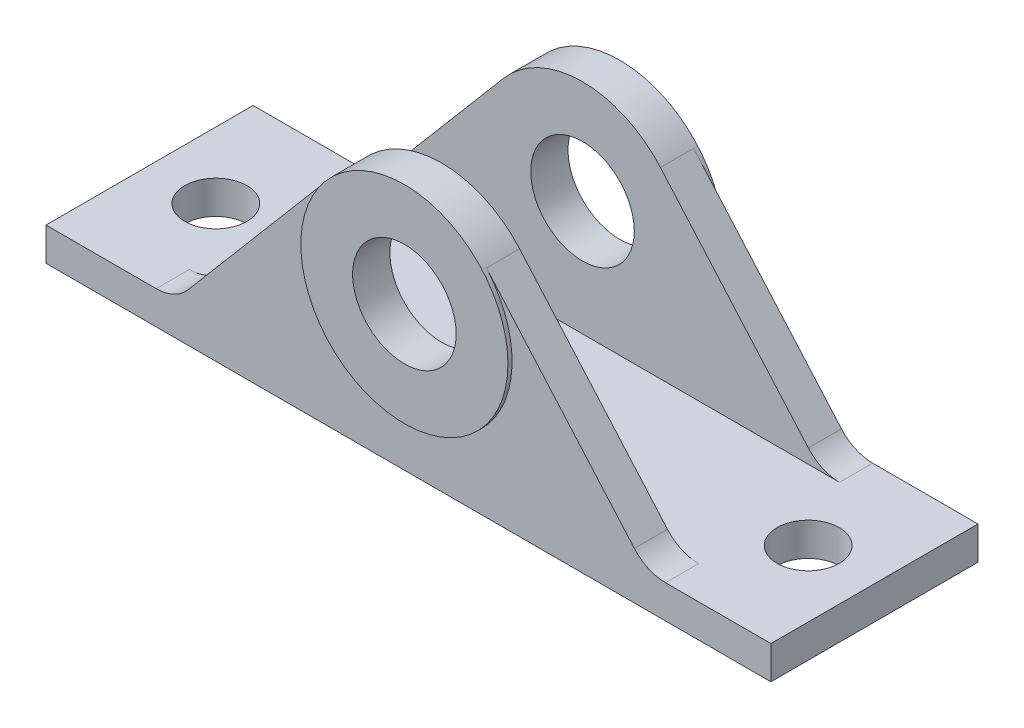
ISO-10303-21;
HEADER;
FILE_DESCRIPTION(('STEP AP214'),'2;1');
FILE_NAME('part.step','',(''),(''),'','','');
FILE_SCHEMA(('AUTOMOTIVE_DESIGN { 1 0 10303 214 1 1 1 1 }'));
ENDSEC;
DATA;
#1=APPLICATION_CONTEXT('core data for automotive mechanical design processes');
#2=APPLICATION_PROTOCOL_DEFINITION('international standard','automotive_design',2000,#1);
#3=PRODUCT_CONTEXT('',#1,'mechanical');
#4=PRODUCT('Part','Part','',(#3));
#5=PRODUCT_RELATED_PRODUCT_CATEGORY('part','',(#4));
#6=PRODUCT_DEFINITION_FORMATION('','',#4);
#7=PRODUCT_DEFINITION_CONTEXT('part definition',#1,'design');
#8=PRODUCT_DEFINITION('design','',#6,#7);
#9=PRODUCT_DEFINITION_SHAPE('','',#8);
#10=(LENGTH_UNIT() NAMED_UNIT(*) SI_UNIT(.MILLI.,.METRE.));
#11=(NAMED_UNIT(*) PLANE_ANGLE_UNIT() SI_UNIT($,.RADIAN.));
#12=(NAMED_UNIT(*) SI_UNIT($,.STERADIAN.) SOLID_ANGLE_UNIT());
#13=UNCERTAINTY_MEASURE_WITH_UNIT(LENGTH_MEASURE(1.E-05),#10,'distance_accuracy_value','');
#14=(GEOMETRIC_REPRESENTATION_CONTEXT(3) GLOBAL_UNCERTAINTY_ASSIGNED_CONTEXT((#13)) GLOBAL_UNIT_ASSIGNED_CONTEXT((#10,
#11,#12)) REPRESENTATION_CONTEXT('',''));
#15=CARTESIAN_POINT('',(0.,0.,0.));
#16=DIRECTION('',(0.,0.,1.));
#17=DIRECTION('',(1.,0.,0.));
#18=AXIS2_PLACEMENT_3D('',#15,#16,#17);
#19=CARTESIAN_POINT('',(0.,8.,50.));
#20=DIRECTION('',(0.,1.,0.));
#21=DIRECTION('',(0.,0.,1.));
#22=AXIS2_PLACEMENT_3D('',#19,#20,#21);
#23=PLANE('',#22);
#24=CARTESIAN_POINT('',(16.,8.,25.));
#25=DIRECTION('',(0.,1.,0.));
#26=DIRECTION('',(0.,0.,1.));
#27=AXIS2_PLACEMENT_3D('',#24,#25,#26);
#28=CIRCLE('',#27,7.5);
#29=CARTESIAN_POINT('',(16.,8.,32.5));
#30=VERTEX_POINT('',#29);
#31=EDGE_CURVE('E399',#30,#30,#28,.T.);
#32=ORIENTED_EDGE('',*,*,#31,.F.);
#33=EDGE_LOOP('',(#32));
#34=FACE_BOUND('',#33,.T.);
#35=CARTESIAN_POINT('',(159.,8.,25.));
#36=DIRECTION('',(0.,1.,0.));
#37=DIRECTION('',(0.,0.,1.));
#38=AXIS2_PLACEMENT_3D('',#35,#36,#37);
#39=CIRCLE('',#38,7.50000000000001);
#40=CARTESIAN_POINT('',(159.,8.,32.5));
#41=VERTEX_POINT('',#40);
#42=EDGE_CURVE('E402',#41,#41,#39,.T.);
#43=ORIENTED_EDGE('',*,*,#42,.F.);
#44=EDGE_LOOP('',(#43));
#45=FACE_BOUND('',#44,.T.);
#46=DIRECTION('',(1.,0.,0.));
#47=VECTOR('',#46,1.);
#48=CARTESIAN_POINT('',(0.,8.,50.));
#49=LINE('',#48,#47);
#50=CARTESIAN_POINT('',(0.,8.,50.));
#51=VERTEX_POINT('',#50);
#52=CARTESIAN_POINT('',(26.5910229898031,8.,50.));
#53=VERTEX_POINT('',#52);
#54=EDGE_CURVE('E247',#51,#53,#49,.T.);
#55=ORIENTED_EDGE('',*,*,#54,.T.);
#56=DIRECTION('',(0.,0.,1.));
#57=VECTOR('',#56,1.);
#58=CARTESIAN_POINT('',(26.5910229898031,8.,42.));
#59=LINE('',#58,#57);
#60=CARTESIAN_POINT('',(26.5910229898031,8.,42.));
#61=VERTEX_POINT('',#60);
#62=EDGE_CURVE('E56',#61,#53,#59,.T.);
#63=ORIENTED_EDGE('',*,*,#62,.F.);
#64=DIRECTION('',(1.,0.,0.));
#65=VECTOR('',#64,1.);
#66=CARTESIAN_POINT('',(0.,8.,42.));
#67=LINE('',#66,#65);
#68=CARTESIAN_POINT('',(149.554580342361,8.,42.));
#69=VERTEX_POINT('',#68);
#70=EDGE_CURVE('E51',#61,#69,#67,.T.);
#71=ORIENTED_EDGE('',*,*,#70,.T.);
#72=DIRECTION('',(0.,0.,1.));
#73=VECTOR('',#72,1.);
#74=CARTESIAN_POINT('',(149.554580342361,8.,42.));
#75=LINE('',#74,#73);
#76=CARTESIAN_POINT('',(149.554580342361,8.,50.));
#77=VERTEX_POINT('',#76);
#78=EDGE_CURVE('E187',#69,#77,#75,.T.);
#79=ORIENTED_EDGE('',*,*,#78,.T.);
#80=CARTESIAN_POINT('',(175.,8.,50.));
#81=VERTEX_POINT('',#80);
#82=EDGE_CURVE('E251',#77,#81,#49,.T.);
#83=ORIENTED_EDGE('',*,*,#82,.T.);
#84=DIRECTION('',(0.,0.,-1.));
#85=VECTOR('',#84,1.);
#86=CARTESIAN_POINT('',(175.,8.,50.));
#87=LINE('',#86,#85);
#88=CARTESIAN_POINT('',(175.,8.,0.));
#89=VERTEX_POINT('',#88);
#90=EDGE_CURVE('E262',#81,#89,#87,.T.);
#91=ORIENTED_EDGE('',*,*,#90,.T.);
#92=DIRECTION('',(1.,0.,0.));
#93=VECTOR('',#92,1.);
#94=CARTESIAN_POINT('',(0.,8.,0.));
#95=LINE('',#94,#93);
#96=CARTESIAN_POINT('',(149.554580342361,8.,0.));
#97=VERTEX_POINT('',#96);
#98=EDGE_CURVE('E246',#97,#89,#95,.T.);
#99=ORIENTED_EDGE('',*,*,#98,.F.);
#100=DIRECTION('',(0.,0.,-1.));
#101=VECTOR('',#100,1.);
#102=CARTESIAN_POINT('',(149.554580342361,8.,8.));
#103=LINE('',#102,#101);
#104=CARTESIAN_POINT('',(149.554580342361,8.,8.));
#105=VERTEX_POINT('',#104);
#106=EDGE_CURVE('E243',#105,#97,#103,.T.);
#107=ORIENTED_EDGE('',*,*,#106,.F.);
#108=DIRECTION('',(1.,0.,0.));
#109=VECTOR('',#108,1.);
#110=CARTESIAN_POINT('',(0.,8.,8.));
#111=LINE('',#110,#109);
#112=CARTESIAN_POINT('',(26.5910229898031,8.,8.));
#113=VERTEX_POINT('',#112);
#114=EDGE_CURVE('E190',#113,#105,#111,.T.);
#115=ORIENTED_EDGE('',*,*,#114,.F.);
#116=DIRECTION('',(0.,0.,-1.));
#117=VECTOR('',#116,1.);
#118=CARTESIAN_POINT('',(26.5910229898031,8.,8.));
#119=LINE('',#118,#117);
#120=CARTESIAN_POINT('',(26.5910229898031,8.,0.));
#121=VERTEX_POINT('',#120);
#122=EDGE_CURVE('E208',#113,#121,#119,.T.);
#123=ORIENTED_EDGE('',*,*,#122,.T.);
#124=CARTESIAN_POINT('',(0.,8.,0.));
#125=VERTEX_POINT('',#124);
#126=EDGE_CURVE('E263',#125,#121,#95,.T.);
#127=ORIENTED_EDGE('',*,*,#126,.F.);
#128=DIRECTION('',(0.,0.,-1.));
#129=VECTOR('',#128,1.);
#130=CARTESIAN_POINT('',(0.,8.,50.));
#131=LINE('',#130,#129);
#132=EDGE_CURVE('E11',#51,#125,#131,.T.);
#133=ORIENTED_EDGE('',*,*,#132,.F.);
#134=EDGE_LOOP('',(#55,#63,#71,#79,#83,#91,#99,#107,#115,#123,#127,#133));
#135=FACE_BOUND('',#134,.T.);
#136=ADVANCED_FACE('F36',(#34,#45,#135),#23,.T.);
#137=CARTESIAN_POINT('',(0.,0.,50.));
#138=DIRECTION('',(-1.,0.,0.));
#139=DIRECTION('',(0.,0.,1.));
#140=AXIS2_PLACEMENT_3D('',#137,#138,#139);
#141=PLANE('',#140);
#142=DIRECTION('',(0.,1.,0.));
#143=VECTOR('',#142,1.);
#144=CARTESIAN_POINT('',(0.,0.,0.));
#145=LINE('',#144,#143);
#146=CARTESIAN_POINT('',(0.,0.,0.));
#147=VERTEX_POINT('',#146);
#148=EDGE_CURVE('E267',#147,#125,#145,.T.);
#149=ORIENTED_EDGE('',*,*,#148,.F.);
#150=DIRECTION('',(0.,0.,-1.));
#151=VECTOR('',#150,1.);
#152=CARTESIAN_POINT('',(0.,0.,50.));
#153=LINE('',#152,#151);
#154=CARTESIAN_POINT('',(0.,0.,50.));
#155=VERTEX_POINT('',#154);
#156=EDGE_CURVE('E44',#155,#147,#153,.T.);
#157=ORIENTED_EDGE('',*,*,#156,.F.);
#158=DIRECTION('',(0.,1.,0.));
#159=VECTOR('',#158,1.);
#160=CARTESIAN_POINT('',(0.,0.,50.));
#161=LINE('',#160,#159);
#162=EDGE_CURVE('E250',#155,#51,#161,.T.);
#163=ORIENTED_EDGE('',*,*,#162,.T.);
#164=ORIENTED_EDGE('',*,*,#132,.T.);
#165=EDGE_LOOP('',(#149,#157,#163,#164));
#166=FACE_BOUND('',#165,.T.);
#167=ADVANCED_FACE('F297',(#166),#141,.T.);
#168=CARTESIAN_POINT('',(0.,0.,50.));
#169=DIRECTION('',(0.,1.,0.));
#170=DIRECTION('',(0.,0.,1.));
#171=AXIS2_PLACEMENT_3D('',#168,#169,#170);
#172=PLANE('',#171);
#173=CARTESIAN_POINT('',(16.,0.,25.));
#174=DIRECTION('',(0.,1.,0.));
#175=DIRECTION('',(0.,0.,1.));
#176=AXIS2_PLACEMENT_3D('',#173,#174,#175);
#177=CIRCLE('',#176,7.5);
#178=CARTESIAN_POINT('',(16.,0.,32.5));
#179=VERTEX_POINT('',#178);
#180=EDGE_CURVE('E405',#179,#179,#177,.T.);
#181=ORIENTED_EDGE('',*,*,#180,.T.);
#182=EDGE_LOOP('',(#181));
#183=FACE_BOUND('',#182,.T.);
#184=CARTESIAN_POINT('',(159.,0.,25.));
#185=DIRECTION('',(0.,1.,0.));
#186=DIRECTION('',(0.,0.,1.));
#187=AXIS2_PLACEMENT_3D('',#184,#185,#186);
#188=CIRCLE('',#187,7.50000000000001);
#189=CARTESIAN_POINT('',(159.,0.,32.5));
#190=VERTEX_POINT('',#189);
#191=EDGE_CURVE('E413',#190,#190,#188,.T.);
#192=ORIENTED_EDGE('',*,*,#191,.T.);
#193=EDGE_LOOP('',(#192));
#194=FACE_BOUND('',#193,.T.);
#195=DIRECTION('',(1.,0.,0.));
#196=VECTOR('',#195,1.);
#197=CARTESIAN_POINT('',(0.,0.,0.));
#198=LINE('',#197,#196);
#199=CARTESIAN_POINT('',(175.,0.,0.));
#200=VERTEX_POINT('',#199);
#201=EDGE_CURVE('E271',#147,#200,#198,.T.);
#202=ORIENTED_EDGE('',*,*,#201,.T.);
#203=DIRECTION('',(0.,0.,-1.));
#204=VECTOR('',#203,1.);
#205=CARTESIAN_POINT('',(175.,0.,50.));
#206=LINE('',#205,#204);
#207=CARTESIAN_POINT('',(175.,0.,50.));
#208=VERTEX_POINT('',#207);
#209=EDGE_CURVE('E281',#208,#200,#206,.T.);
#210=ORIENTED_EDGE('',*,*,#209,.F.);
#211=DIRECTION('',(1.,0.,0.));
#212=VECTOR('',#211,1.);
#213=CARTESIAN_POINT('',(0.,0.,50.));
#214=LINE('',#213,#212);
#215=EDGE_CURVE('E255',#155,#208,#214,.T.);
#216=ORIENTED_EDGE('',*,*,#215,.F.);
#217=ORIENTED_EDGE('',*,*,#156,.T.);
#218=EDGE_LOOP('',(#202,#210,#216,#217));
#219=FACE_BOUND('',#218,.T.);
#220=ADVANCED_FACE('F289',(#183,#194,#219),#172,.F.);
#221=CARTESIAN_POINT('',(175.,0.,50.));
#222=DIRECTION('',(-1.,0.,0.));
#223=DIRECTION('',(0.,0.,1.));
#224=AXIS2_PLACEMENT_3D('',#221,#222,#223);
#225=PLANE('',#224);
#226=DIRECTION('',(0.,1.,0.));
#227=VECTOR('',#226,1.);
#228=CARTESIAN_POINT('',(175.,0.,0.));
#229=LINE('',#228,#227);
#230=EDGE_CURVE('E274',#200,#89,#229,.T.);
#231=ORIENTED_EDGE('',*,*,#230,.T.);
#232=ORIENTED_EDGE('',*,*,#90,.F.);
#233=DIRECTION('',(0.,1.,0.));
#234=VECTOR('',#233,1.);
#235=CARTESIAN_POINT('',(175.,0.,50.));
#236=LINE('',#235,#234);
#237=EDGE_CURVE('E258',#208,#81,#236,.T.);
#238=ORIENTED_EDGE('',*,*,#237,.F.);
#239=ORIENTED_EDGE('',*,*,#209,.T.);
#240=EDGE_LOOP('',(#231,#232,#238,#239));
#241=FACE_BOUND('',#240,.T.);
#242=ADVANCED_FACE('F380',(#241),#225,.F.);
#243=CARTESIAN_POINT('',(0.,0.,50.));
#244=DIRECTION('',(0.,0.,1.));
#245=DIRECTION('',(1.,0.,0.));
#246=AXIS2_PLACEMENT_3D('',#243,#244,#245);
#247=PLANE('',#246);
#248=ORIENTED_EDGE('',*,*,#54,.F.);
#249=ORIENTED_EDGE('',*,*,#162,.F.);
#250=ORIENTED_EDGE('',*,*,#215,.T.);
#251=ORIENTED_EDGE('',*,*,#237,.T.);
#252=ORIENTED_EDGE('',*,*,#82,.F.);
#253=CARTESIAN_POINT('',(149.554580342361,18.,50.));
#254=DIRECTION('',(0.,0.,1.));
#255=DIRECTION('',(1.,0.,0.));
#256=AXIS2_PLACEMENT_3D('',#253,#254,#255);
#257=CIRCLE('',#256,10.);
#258=CARTESIAN_POINT('',(142.0295661025,11.4140937837007,50.));
#259=VERTEX_POINT('',#258);
#260=EDGE_CURVE('E345',#77,#259,#257,.F.);
#261=ORIENTED_EDGE('',*,*,#260,.T.);
#262=DIRECTION('',(0.658590621629925,-0.752501423986101,0.));
#263=VECTOR('',#262,1.);
#264=CARTESIAN_POINT('',(86.0821489565223,75.3392541002859,50.));
#265=LINE('',#264,#263);
#266=CARTESIAN_POINT('',(106.332559554624,52.2012647167426,50.));
#267=VERTEX_POINT('',#266);
#268=EDGE_CURVE('E349',#267,#259,#265,.T.);
#269=ORIENTED_EDGE('',*,*,#268,.F.);
#270=CARTESIAN_POINT('',(87.5200239549711,35.7364991759944,50.));
#271=DIRECTION('',(0.,0.,1.));
#272=DIRECTION('',(1.,0.,0.));
#273=AXIS2_PLACEMENT_3D('',#270,#271,#272);
#274=CIRCLE('',#273,25.);
#275=CARTESIAN_POINT('',(68.452348329964,51.9051028961525,50.));
#276=VERTEX_POINT('',#275);
#277=EDGE_CURVE('E353',#276,#267,#274,.T.);
#278=ORIENTED_EDGE('',*,*,#277,.F.);
#279=DIRECTION('',(0.646744148806324,0.762707025000283,0.));
#280=VECTOR('',#279,1.);
#281=CARTESIAN_POINT('',(14.2166799827152,-12.0551591802496,50.));
#282=LINE('',#281,#280);
#283=CARTESIAN_POINT('',(34.218093239806,11.5325585119368,50.));
#284=VERTEX_POINT('',#283);
#285=EDGE_CURVE('E172',#284,#276,#282,.T.);
#286=ORIENTED_EDGE('',*,*,#285,.F.);
#287=CARTESIAN_POINT('',(26.5910229898031,18.,50.));
#288=DIRECTION('',(0.,0.,1.));
#289=DIRECTION('',(1.,0.,0.));
#290=AXIS2_PLACEMENT_3D('',#287,#288,#289);
#291=CIRCLE('',#290,10.);
#292=EDGE_CURVE('E337',#284,#53,#291,.F.);
#293=ORIENTED_EDGE('',*,*,#292,.T.);
#294=EDGE_LOOP('',(#248,#249,#250,#251,#252,#261,#269,#278,#286,#293));
#295=FACE_BOUND('',#294,.T.);
#296=ADVANCED_FACE('F366',(#295),#247,.T.);
#297=CARTESIAN_POINT('',(0.,0.,0.));
#298=DIRECTION('',(0.,0.,1.));
#299=DIRECTION('',(1.,0.,0.));
#300=AXIS2_PLACEMENT_3D('',#297,#298,#299);
#301=PLANE('',#300);
#302=ORIENTED_EDGE('',*,*,#126,.T.);
#303=CARTESIAN_POINT('',(26.5910229898031,18.,0.));
#304=DIRECTION('',(0.,0.,1.));
#305=DIRECTION('',(1.,0.,0.));
#306=AXIS2_PLACEMENT_3D('',#303,#304,#305);
#307=CIRCLE('',#306,10.);
#308=CARTESIAN_POINT('',(34.218093239806,11.5325585119368,0.));
#309=VERTEX_POINT('',#308);
#310=EDGE_CURVE('E195',#309,#121,#307,.F.);
#311=ORIENTED_EDGE('',*,*,#310,.F.);
#312=DIRECTION('',(0.646744148806324,0.762707025000283,0.));
#313=VECTOR('',#312,1.);
#314=CARTESIAN_POINT('',(14.2166799827152,-12.0551591802496,0.));
#315=LINE('',#314,#313);
#316=CARTESIAN_POINT('',(68.452348329964,51.9051028961525,0.));
#317=VERTEX_POINT('',#316);
#318=EDGE_CURVE('E221',#309,#317,#315,.T.);
#319=ORIENTED_EDGE('',*,*,#318,.T.);
#320=CARTESIAN_POINT('',(87.5200239549711,35.7364991759944,0.));
#321=DIRECTION('',(0.,0.,1.));
#322=DIRECTION('',(1.,0.,0.));
#323=AXIS2_PLACEMENT_3D('',#320,#321,#322);
#324=CIRCLE('',#323,25.);
#325=CARTESIAN_POINT('',(106.332559554624,52.2012647167426,0.));
#326=VERTEX_POINT('',#325);
#327=EDGE_CURVE('E217',#317,#326,#324,.T.);
#328=ORIENTED_EDGE('',*,*,#327,.T.);
#329=DIRECTION('',(0.658590621629925,-0.752501423986101,0.));
#330=VECTOR('',#329,1.);
#331=CARTESIAN_POINT('',(86.0821489565223,75.3392541002859,0.));
#332=LINE('',#331,#330);
#333=CARTESIAN_POINT('',(142.0295661025,11.4140937837007,0.));
#334=VERTEX_POINT('',#333);
#335=EDGE_CURVE('E213',#326,#334,#332,.T.);
#336=ORIENTED_EDGE('',*,*,#335,.T.);
#337=CARTESIAN_POINT('',(149.554580342361,18.,0.));
#338=DIRECTION('',(0.,0.,1.));
#339=DIRECTION('',(1.,0.,0.));
#340=AXIS2_PLACEMENT_3D('',#337,#338,#339);
#341=CIRCLE('',#340,10.);
#342=EDGE_CURVE('E209',#97,#334,#341,.F.);
#343=ORIENTED_EDGE('',*,*,#342,.F.);
#344=ORIENTED_EDGE('',*,*,#98,.T.);
#345=ORIENTED_EDGE('',*,*,#230,.F.);
#346=ORIENTED_EDGE('',*,*,#201,.F.);
#347=ORIENTED_EDGE('',*,*,#148,.T.);
#348=EDGE_LOOP('',(#302,#311,#319,#328,#336,#343,#344,#345,#346,#347));
#349=FACE_BOUND('',#348,.T.);
#350=ADVANCED_FACE('F296',(#349),#301,.F.);
#351=CARTESIAN_POINT('',(149.554580342361,18.,8.));
#352=DIRECTION('',(0.,0.,-1.));
#353=DIRECTION('',(-1.,0.,0.));
#354=AXIS2_PLACEMENT_3D('',#351,#352,#353);
#355=CYLINDRICAL_SURFACE('',#354,10.);
#356=ORIENTED_EDGE('',*,*,#342,.T.);
#357=DIRECTION('',(0.,0.,-1.));
#358=VECTOR('',#357,1.);
#359=CARTESIAN_POINT('',(142.0295661025,11.4140937837007,8.));
#360=LINE('',#359,#358);
#361=CARTESIAN_POINT('',(142.0295661025,11.4140937837007,8.));
#362=VERTEX_POINT('',#361);
#363=EDGE_CURVE('E240',#362,#334,#360,.T.);
#364=ORIENTED_EDGE('',*,*,#363,.F.);
#365=CARTESIAN_POINT('',(149.554580342361,18.,8.));
#366=DIRECTION('',(0.,0.,1.));
#367=DIRECTION('',(1.,0.,0.));
#368=AXIS2_PLACEMENT_3D('',#365,#366,#367);
#369=CIRCLE('',#368,10.);
#370=EDGE_CURVE('E194',#105,#362,#369,.F.);
#371=ORIENTED_EDGE('',*,*,#370,.F.);
#372=ORIENTED_EDGE('',*,*,#106,.T.);
#373=EDGE_LOOP('',(#356,#364,#371,#372));
#374=FACE_BOUND('',#373,.T.);
#375=ADVANCED_FACE('F470',(#374),#355,.F.);
#376=CARTESIAN_POINT('',(86.0821489565223,75.3392541002859,8.));
#377=DIRECTION('',(0.752501423986101,0.658590621629925,0.));
#378=DIRECTION('',(-0.658590621629925,0.752501423986101,0.));
#379=AXIS2_PLACEMENT_3D('',#376,#377,#378);
#380=PLANE('',#379);
#381=ORIENTED_EDGE('',*,*,#335,.F.);
#382=DIRECTION('',(0.,0.,-1.));
#383=VECTOR('',#382,1.);
#384=CARTESIAN_POINT('',(106.332559554624,52.2012647167426,8.));
#385=LINE('',#384,#383);
#386=CARTESIAN_POINT('',(106.332559554624,52.2012647167425,8.));
#387=VERTEX_POINT('',#386);
#388=EDGE_CURVE('E236',#387,#326,#385,.T.);
#389=ORIENTED_EDGE('',*,*,#388,.F.);
#390=DIRECTION('',(0.658590621629925,-0.752501423986101,0.));
#391=VECTOR('',#390,1.);
#392=CARTESIAN_POINT('',(86.0821489565223,75.3392541002859,8.));
#393=LINE('',#392,#391);
#394=EDGE_CURVE('E198',#387,#362,#393,.T.);
#395=ORIENTED_EDGE('',*,*,#394,.T.);
#396=ORIENTED_EDGE('',*,*,#363,.T.);
#397=EDGE_LOOP('',(#381,#389,#395,#396));
#398=FACE_BOUND('',#397,.T.);
#399=ADVANCED_FACE('F467',(#398),#380,.T.);
#400=CARTESIAN_POINT('',(14.2166799827152,-12.0551591802496,8.));
#401=DIRECTION('',(-0.762707025000283,0.646744148806324,0.));
#402=DIRECTION('',(-0.646744148806324,-0.762707025000283,0.));
#403=AXIS2_PLACEMENT_3D('',#400,#401,#402);
#404=PLANE('',#403);
#405=ORIENTED_EDGE('',*,*,#318,.F.);
#406=DIRECTION('',(0.,0.,-1.));
#407=VECTOR('',#406,1.);
#408=CARTESIAN_POINT('',(34.218093239806,11.5325585119368,8.));
#409=LINE('',#408,#407);
#410=CARTESIAN_POINT('',(34.218093239806,11.5325585119368,8.));
#411=VERTEX_POINT('',#410);
#412=EDGE_CURVE('E230',#411,#309,#409,.T.);
#413=ORIENTED_EDGE('',*,*,#412,.F.);
#414=DIRECTION('',(0.646744148806324,0.762707025000283,0.));
#415=VECTOR('',#414,1.);
#416=CARTESIAN_POINT('',(14.2166799827152,-12.0551591802496,8.));
#417=LINE('',#416,#415);
#418=CARTESIAN_POINT('',(68.452348329964,51.9051028961525,8.));
#419=VERTEX_POINT('',#418);
#420=EDGE_CURVE('E202',#411,#419,#417,.T.);
#421=ORIENTED_EDGE('',*,*,#420,.T.);
#422=DIRECTION('',(0.,0.,-1.));
#423=VECTOR('',#422,1.);
#424=CARTESIAN_POINT('',(68.452348329964,51.9051028961525,8.));
#425=LINE('',#424,#423);
#426=EDGE_CURVE('E233',#419,#317,#425,.T.);
#427=ORIENTED_EDGE('',*,*,#426,.T.);
#428=EDGE_LOOP('',(#405,#413,#421,#427));
#429=FACE_BOUND('',#428,.T.);
#430=ADVANCED_FACE('F307',(#429),#404,.T.);
#431=CARTESIAN_POINT('',(26.5910229898031,18.,8.));
#432=DIRECTION('',(0.,0.,-1.));
#433=DIRECTION('',(-1.,0.,0.));
#434=AXIS2_PLACEMENT_3D('',#431,#432,#433);
#435=CYLINDRICAL_SURFACE('',#434,10.);
#436=ORIENTED_EDGE('',*,*,#310,.T.);
#437=ORIENTED_EDGE('',*,*,#122,.F.);
#438=CARTESIAN_POINT('',(26.5910229898031,18.,8.));
#439=DIRECTION('',(0.,0.,1.));
#440=DIRECTION('',(1.,0.,0.));
#441=AXIS2_PLACEMENT_3D('',#438,#439,#440);
#442=CIRCLE('',#441,10.);
#443=EDGE_CURVE('E205',#411,#113,#442,.F.);
#444=ORIENTED_EDGE('',*,*,#443,.F.);
#445=ORIENTED_EDGE('',*,*,#412,.T.);
#446=EDGE_LOOP('',(#436,#437,#444,#445));
#447=FACE_BOUND('',#446,.T.);
#448=ADVANCED_FACE('F462',(#447),#435,.F.);
#449=CARTESIAN_POINT('',(0.,0.,8.));
#450=DIRECTION('',(0.,0.,1.));
#451=DIRECTION('',(1.,0.,0.));
#452=AXIS2_PLACEMENT_3D('',#449,#450,#451);
#453=PLANE('',#452);
#454=ORIENTED_EDGE('',*,*,#114,.T.);
#455=ORIENTED_EDGE('',*,*,#370,.T.);
#456=ORIENTED_EDGE('',*,*,#394,.F.);
#457=CARTESIAN_POINT('',(87.5200239549711,35.7364991759944,8.));
#458=DIRECTION('',(0.,0.,1.));
#459=DIRECTION('',(1.,0.,0.));
#460=AXIS2_PLACEMENT_3D('',#457,#458,#459);
#461=CIRCLE('',#460,25.);
#462=EDGE_CURVE('E315',#387,#419,#461,.T.);
#463=ORIENTED_EDGE('',*,*,#462,.T.);
#464=ORIENTED_EDGE('',*,*,#420,.F.);
#465=ORIENTED_EDGE('',*,*,#443,.T.);
#466=EDGE_LOOP('',(#454,#455,#456,#463,#464,#465));
#467=FACE_BOUND('',#466,.T.);
#468=CARTESIAN_POINT('',(87.5200239549711,35.7364991759944,8.));
#469=DIRECTION('',(0.,0.,1.));
#470=DIRECTION('',(1.,0.,0.));
#471=AXIS2_PLACEMENT_3D('',#468,#469,#470);
#472=CIRCLE('',#471,12.5);
#473=CARTESIAN_POINT('',(100.020023954971,35.7364991759944,8.));
#474=VERTEX_POINT('',#473);
#475=EDGE_CURVE('E322',#474,#474,#472,.T.);
#476=ORIENTED_EDGE('',*,*,#475,.F.);
#477=EDGE_LOOP('',(#476));
#478=FACE_BOUND('',#477,.T.);
#479=ADVANCED_FACE('F317',(#467,#478),#453,.T.);
#480=CARTESIAN_POINT('',(26.5910229898031,18.,42.));
#481=DIRECTION('',(0.,0.,1.));
#482=DIRECTION('',(1.,0.,0.));
#483=AXIS2_PLACEMENT_3D('',#480,#481,#482);
#484=CYLINDRICAL_SURFACE('',#483,10.);
#485=ORIENTED_EDGE('',*,*,#292,.F.);
#486=DIRECTION('',(0.,0.,1.));
#487=VECTOR('',#486,1.);
#488=CARTESIAN_POINT('',(34.218093239806,11.5325585119368,42.));
#489=LINE('',#488,#487);
#490=CARTESIAN_POINT('',(34.218093239806,11.5325585119368,42.));
#491=VERTEX_POINT('',#490);
#492=EDGE_CURVE('E175',#491,#284,#489,.T.);
#493=ORIENTED_EDGE('',*,*,#492,.F.);
#494=CARTESIAN_POINT('',(26.5910229898031,18.,42.));
#495=DIRECTION('',(0.,0.,1.));
#496=DIRECTION('',(1.,0.,0.));
#497=AXIS2_PLACEMENT_3D('',#494,#495,#496);
#498=CIRCLE('',#497,10.);
#499=EDGE_CURVE('E165',#491,#61,#498,.F.);
#500=ORIENTED_EDGE('',*,*,#499,.T.);
#501=ORIENTED_EDGE('',*,*,#62,.T.);
#502=EDGE_LOOP('',(#485,#493,#500,#501));
#503=FACE_BOUND('',#502,.T.);
#504=ADVANCED_FACE('F364',(#503),#484,.F.);
#505=CARTESIAN_POINT('',(14.2166799827152,-12.0551591802496,42.));
#506=DIRECTION('',(0.762707025000283,-0.646744148806324,0.));
#507=DIRECTION('',(0.646744148806324,0.762707025000283,0.));
#508=AXIS2_PLACEMENT_3D('',#505,#506,#507);
#509=PLANE('',#508);
#510=ORIENTED_EDGE('',*,*,#285,.T.);
#511=DIRECTION('',(0.,0.,1.));
#512=VECTOR('',#511,1.);
#513=CARTESIAN_POINT('',(68.452348329964,51.9051028961525,42.));
#514=LINE('',#513,#512);
#515=CARTESIAN_POINT('',(68.452348329964,51.9051028961525,42.));
#516=VERTEX_POINT('',#515);
#517=EDGE_CURVE('E150',#516,#276,#514,.T.);
#518=ORIENTED_EDGE('',*,*,#517,.F.);
#519=DIRECTION('',(0.646744148806324,0.762707025000283,0.));
#520=VECTOR('',#519,1.);
#521=CARTESIAN_POINT('',(14.2166799827152,-12.0551591802496,42.));
#522=LINE('',#521,#520);
#523=EDGE_CURVE('E162',#491,#516,#522,.T.);
#524=ORIENTED_EDGE('',*,*,#523,.F.);
#525=ORIENTED_EDGE('',*,*,#492,.T.);
#526=EDGE_LOOP('',(#510,#518,#524,#525));
#527=FACE_BOUND('',#526,.T.);
#528=ADVANCED_FACE('F170',(#527),#509,.F.);
#529=CARTESIAN_POINT('',(86.0821489565223,75.3392541002859,42.));
#530=DIRECTION('',(-0.752501423986101,-0.658590621629925,0.));
#531=DIRECTION('',(0.658590621629925,-0.752501423986101,0.));
#532=AXIS2_PLACEMENT_3D('',#529,#530,#531);
#533=PLANE('',#532);
#534=ORIENTED_EDGE('',*,*,#268,.T.);
#535=DIRECTION('',(0.,0.,1.));
#536=VECTOR('',#535,1.);
#537=CARTESIAN_POINT('',(142.0295661025,11.4140937837007,42.));
#538=LINE('',#537,#536);
#539=CARTESIAN_POINT('',(142.0295661025,11.4140937837007,42.));
#540=VERTEX_POINT('',#539);
#541=EDGE_CURVE('E181',#540,#259,#538,.T.);
#542=ORIENTED_EDGE('',*,*,#541,.F.);
#543=DIRECTION('',(0.658590621629925,-0.752501423986101,0.));
#544=VECTOR('',#543,1.);
#545=CARTESIAN_POINT('',(86.0821489565223,75.3392541002859,42.));
#546=LINE('',#545,#544);
#547=CARTESIAN_POINT('',(106.332559554624,52.2012647167426,42.));
#548=VERTEX_POINT('',#547);
#549=EDGE_CURVE('E168',#548,#540,#546,.T.);
#550=ORIENTED_EDGE('',*,*,#549,.F.);
#551=DIRECTION('',(0.,0.,1.));
#552=VECTOR('',#551,1.);
#553=CARTESIAN_POINT('',(106.332559554624,52.2012647167426,42.));
#554=LINE('',#553,#552);
#555=EDGE_CURVE('E153',#548,#267,#554,.T.);
#556=ORIENTED_EDGE('',*,*,#555,.T.);
#557=EDGE_LOOP('',(#534,#542,#550,#556));
#558=FACE_BOUND('',#557,.T.);
#559=ADVANCED_FACE('F369',(#558),#533,.F.);
#560=CARTESIAN_POINT('',(149.554580342361,18.,42.));
#561=DIRECTION('',(0.,0.,1.));
#562=DIRECTION('',(1.,0.,0.));
#563=AXIS2_PLACEMENT_3D('',#560,#561,#562);
#564=CYLINDRICAL_SURFACE('',#563,10.);
#565=ORIENTED_EDGE('',*,*,#260,.F.);
#566=ORIENTED_EDGE('',*,*,#78,.F.);
#567=CARTESIAN_POINT('',(149.554580342361,18.,42.));
#568=DIRECTION('',(0.,0.,1.));
#569=DIRECTION('',(1.,0.,0.));
#570=AXIS2_PLACEMENT_3D('',#567,#568,#569);
#571=CIRCLE('',#570,10.);
#572=EDGE_CURVE('E336',#69,#540,#571,.F.);
#573=ORIENTED_EDGE('',*,*,#572,.T.);
#574=ORIENTED_EDGE('',*,*,#541,.T.);
#575=EDGE_LOOP('',(#565,#566,#573,#574));
#576=FACE_BOUND('',#575,.T.);
#577=ADVANCED_FACE('F374',(#576),#564,.F.);
#578=CARTESIAN_POINT('',(0.,0.,42.));
#579=DIRECTION('',(0.,0.,1.));
#580=DIRECTION('',(1.,0.,0.));
#581=AXIS2_PLACEMENT_3D('',#578,#579,#580);
#582=PLANE('',#581);
#583=CARTESIAN_POINT('',(87.5200239549711,35.7364991759944,42.));
#584=DIRECTION('',(0.,0.,1.));
#585=DIRECTION('',(1.,0.,0.));
#586=AXIS2_PLACEMENT_3D('',#583,#584,#585);
#587=CIRCLE('',#586,12.5);
#588=CARTESIAN_POINT('',(100.020023954971,35.7364991759944,42.));
#589=VERTEX_POINT('',#588);
#590=EDGE_CURVE('E158',#589,#589,#587,.F.);
#591=ORIENTED_EDGE('',*,*,#590,.F.);
#592=EDGE_LOOP('',(#591));
#593=FACE_BOUND('',#592,.T.);
#594=ORIENTED_EDGE('',*,*,#70,.F.);
#595=ORIENTED_EDGE('',*,*,#499,.F.);
#596=ORIENTED_EDGE('',*,*,#523,.T.);
#597=CARTESIAN_POINT('',(87.5200239549711,35.7364991759944,42.));
#598=DIRECTION('',(0.,0.,1.));
#599=DIRECTION('',(1.,0.,0.));
#600=AXIS2_PLACEMENT_3D('',#597,#598,#599);
#601=CIRCLE('',#600,25.);
#602=EDGE_CURVE('E146',#548,#516,#601,.T.);
#603=ORIENTED_EDGE('',*,*,#602,.F.);
#604=ORIENTED_EDGE('',*,*,#549,.T.);
#605=ORIENTED_EDGE('',*,*,#572,.F.);
#606=EDGE_LOOP('',(#594,#595,#596,#603,#604,#605));
#607=FACE_BOUND('',#606,.T.);
#608=ADVANCED_FACE('F163',(#593,#607),#582,.F.);
#609=CARTESIAN_POINT('',(87.5200239549711,35.7364991759944,-0.999999999999999));
#610=DIRECTION('',(0.,0.,1.));
#611=DIRECTION('',(1.,0.,0.));
#612=AXIS2_PLACEMENT_3D('',#609,#610,#611);
#613=CYLINDRICAL_SURFACE('',#612,25.);
#614=CARTESIAN_POINT('',(87.5200239549711,35.7364991759944,-0.999999999999999));
#615=DIRECTION('',(0.,0.,1.));
#616=DIRECTION('',(1.,0.,0.));
#617=AXIS2_PLACEMENT_3D('',#614,#615,#616);
#618=CIRCLE('',#617,25.);
#619=CARTESIAN_POINT('',(112.520023954971,35.7364991759944,-0.999999999999999));
#620=VERTEX_POINT('',#619);
#621=EDGE_CURVE('E328',#620,#620,#618,.T.);
#622=ORIENTED_EDGE('',*,*,#621,.T.);
#623=EDGE_LOOP('',(#622));
#624=FACE_BOUND('',#623,.T.);
#625=ORIENTED_EDGE('',*,*,#388,.T.);
#626=ORIENTED_EDGE('',*,*,#327,.F.);
#627=ORIENTED_EDGE('',*,*,#426,.F.);
#628=ORIENTED_EDGE('',*,*,#462,.F.);
#629=EDGE_LOOP('',(#625,#626,#627,#628));
#630=FACE_BOUND('',#629,.T.);
#631=ADVANCED_FACE('F314',(#624,#630),#613,.T.);
#632=CARTESIAN_POINT('',(87.5200239549711,35.7364991759944,-0.999999999999999));
#633=DIRECTION('',(0.,0.,1.));
#634=DIRECTION('',(1.,0.,0.));
#635=AXIS2_PLACEMENT_3D('',#632,#633,#634);
#636=CYLINDRICAL_SURFACE('',#635,12.5);
#637=CARTESIAN_POINT('',(87.5200239549711,35.7364991759944,-0.999999999999999));
#638=DIRECTION('',(0.,0.,1.));
#639=DIRECTION('',(1.,0.,0.));
#640=AXIS2_PLACEMENT_3D('',#637,#638,#639);
#641=CIRCLE('',#640,12.5);
#642=CARTESIAN_POINT('',(100.020023954971,35.7364991759944,-0.999999999999999));
#643=VERTEX_POINT('',#642);
#644=EDGE_CURVE('E321',#643,#643,#641,.T.);
#645=ORIENTED_EDGE('',*,*,#644,.F.);
#646=EDGE_LOOP('',(#645));
#647=FACE_BOUND('',#646,.T.);
#648=ORIENTED_EDGE('',*,*,#475,.T.);
#649=EDGE_LOOP('',(#648));
#650=FACE_BOUND('',#649,.T.);
#651=ADVANCED_FACE('F433',(#647,#650),#636,.F.);
#652=CARTESIAN_POINT('',(0.,0.,-0.999999999999999));
#653=DIRECTION('',(0.,0.,1.));
#654=DIRECTION('',(1.,0.,0.));
#655=AXIS2_PLACEMENT_3D('',#652,#653,#654);
#656=PLANE('',#655);
#657=ORIENTED_EDGE('',*,*,#644,.T.);
#658=EDGE_LOOP('',(#657));
#659=FACE_BOUND('',#658,.T.);
#660=ORIENTED_EDGE('',*,*,#621,.F.);
#661=EDGE_LOOP('',(#660));
#662=FACE_BOUND('',#661,.T.);
#663=ADVANCED_FACE('F431',(#659,#662),#656,.F.);
#664=CARTESIAN_POINT('',(87.5200239549711,35.7364991759944,51.));
#665=DIRECTION('',(0.,0.,-1.));
#666=DIRECTION('',(-1.,0.,0.));
#667=AXIS2_PLACEMENT_3D('',#664,#665,#666);
#668=CYLINDRICAL_SURFACE('',#667,25.);
#669=CARTESIAN_POINT('',(87.5200239549711,35.7364991759944,51.));
#670=DIRECTION('',(0.,0.,1.));
#671=DIRECTION('',(1.,0.,0.));
#672=AXIS2_PLACEMENT_3D('',#669,#670,#671);
#673=CIRCLE('',#672,25.);
#674=CARTESIAN_POINT('',(112.520023954971,35.7364991759944,51.));
#675=VERTEX_POINT('',#674);
#676=EDGE_CURVE('E157',#675,#675,#673,.T.);
#677=ORIENTED_EDGE('',*,*,#676,.F.);
#678=EDGE_LOOP('',(#677));
#679=FACE_BOUND('',#678,.T.);
#680=ORIENTED_EDGE('',*,*,#602,.T.);
#681=ORIENTED_EDGE('',*,*,#517,.T.);
#682=ORIENTED_EDGE('',*,*,#277,.T.);
#683=ORIENTED_EDGE('',*,*,#555,.F.);
#684=EDGE_LOOP('',(#680,#681,#682,#683));
#685=FACE_BOUND('',#684,.T.);
#686=ADVANCED_FACE('F148',(#679,#685),#668,.T.);
#687=CARTESIAN_POINT('',(87.5200239549711,35.7364991759944,51.));
#688=DIRECTION('',(0.,0.,1.));
#689=DIRECTION('',(1.,0.,0.));
#690=AXIS2_PLACEMENT_3D('',#687,#688,#689);
#691=PLANE('',#690);
#692=CARTESIAN_POINT('',(87.5200239549711,35.7364991759944,51.));
#693=DIRECTION('',(0.,0.,1.));
#694=DIRECTION('',(1.,0.,0.));
#695=AXIS2_PLACEMENT_3D('',#692,#693,#694);
#696=CIRCLE('',#695,12.5);
#697=CARTESIAN_POINT('',(100.020023954971,35.7364991759944,51.));
#698=VERTEX_POINT('',#697);
#699=EDGE_CURVE('E410',#698,#698,#696,.T.);
#700=ORIENTED_EDGE('',*,*,#699,.F.);
#701=EDGE_LOOP('',(#700));
#702=FACE_BOUND('',#701,.T.);
#703=ORIENTED_EDGE('',*,*,#676,.T.);
#704=EDGE_LOOP('',(#703));
#705=FACE_BOUND('',#704,.T.);
#706=ADVANCED_FACE('F440',(#702,#705),#691,.T.);
#707=CARTESIAN_POINT('',(87.5200239549711,35.7364991759944,51.));
#708=DIRECTION('',(0.,0.,-1.));
#709=DIRECTION('',(-1.,0.,0.));
#710=AXIS2_PLACEMENT_3D('',#707,#708,#709);
#711=CYLINDRICAL_SURFACE('',#710,12.5);
#712=ORIENTED_EDGE('',*,*,#699,.T.);
#713=EDGE_LOOP('',(#712));
#714=FACE_BOUND('',#713,.T.);
#715=ORIENTED_EDGE('',*,*,#590,.T.);
#716=EDGE_LOOP('',(#715));
#717=FACE_BOUND('',#716,.T.);
#718=ADVANCED_FACE('F547',(#714,#717),#711,.F.);
#719=CARTESIAN_POINT('',(159.,0.,25.));
#720=DIRECTION('',(0.,1.,0.));
#721=DIRECTION('',(0.,0.,1.));
#722=AXIS2_PLACEMENT_3D('',#719,#720,#721);
#723=CYLINDRICAL_SURFACE('',#722,7.50000000000001);
#724=ORIENTED_EDGE('',*,*,#42,.T.);
#725=EDGE_LOOP('',(#724));
#726=FACE_BOUND('',#725,.T.);
#727=ORIENTED_EDGE('',*,*,#191,.F.);
#728=EDGE_LOOP('',(#727));
#729=FACE_BOUND('',#728,.T.);
#730=ADVANCED_FACE('F556',(#726,#729),#723,.F.);
#731=CARTESIAN_POINT('',(16.,0.,25.));
#732=DIRECTION('',(0.,1.,0.));
#733=DIRECTION('',(0.,0.,1.));
#734=AXIS2_PLACEMENT_3D('',#731,#732,#733);
#735=CYLINDRICAL_SURFACE('',#734,7.5);
#736=ORIENTED_EDGE('',*,*,#31,.T.);
#737=EDGE_LOOP('',(#736));
#738=FACE_BOUND('',#737,.T.);
#739=ORIENTED_EDGE('',*,*,#180,.F.);
#740=EDGE_LOOP('',(#739));
#741=FACE_BOUND('',#740,.T.);
#742=ADVANCED_FACE('F567',(#738,#741),#735,.F.);
#743=CLOSED_SHELL('',(#136,#167,#220,#242,#296,#350,#375,#399,#430,#448,#479,#504,#528,#559,
#577,#608,#631,#651,#663,#686,#706,#718,#730,#742));
#744=MANIFOLD_SOLID_BREP('B2',#743);
#745=ADVANCED_BREP_SHAPE_REPRESENTATION('',(#18,#744),#14);
#746=SHAPE_DEFINITION_REPRESENTATION(#9,#745);
ENDSEC;
END-ISO-10303-21;
